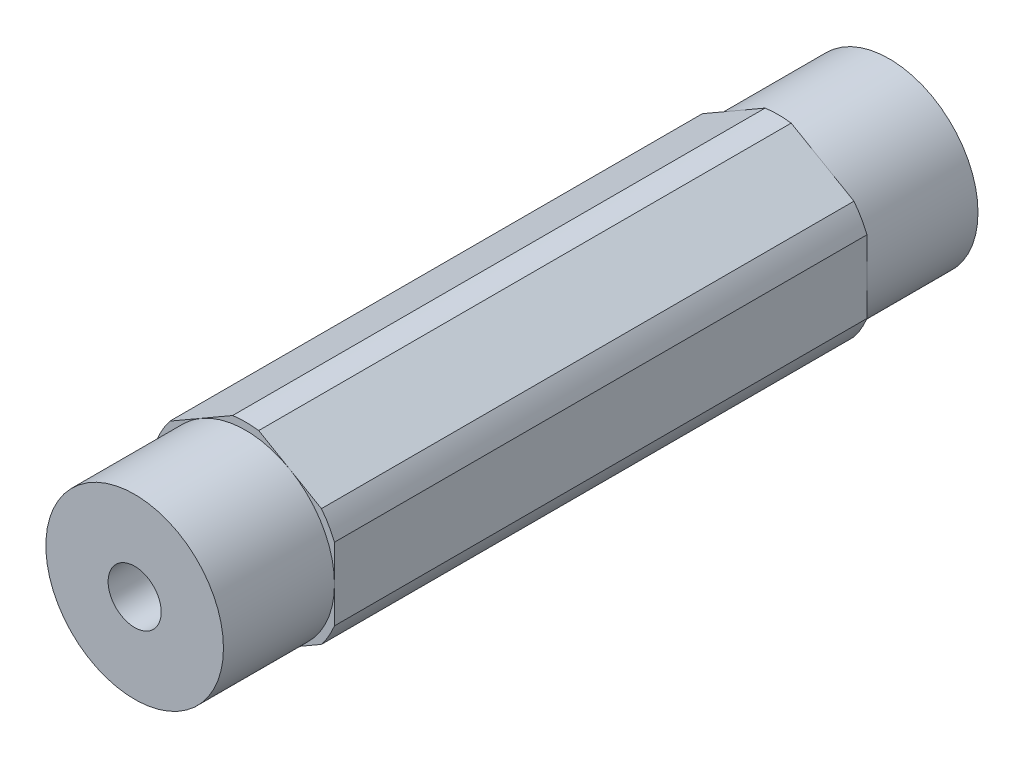
ISO-10303-21;
HEADER;
FILE_DESCRIPTION(('STEP AP214'),'2;1');
FILE_NAME('part.step','',(''),(''),'','','');
FILE_SCHEMA(('AUTOMOTIVE_DESIGN { 1 0 10303 214 1 1 1 1 }'));
ENDSEC;
DATA;
#1=APPLICATION_CONTEXT('core data for automotive mechanical design processes');
#2=APPLICATION_PROTOCOL_DEFINITION('international standard','automotive_design',2000,#1);
#3=PRODUCT_CONTEXT('',#1,'mechanical');
#4=PRODUCT('Part','Part','',(#3));
#5=PRODUCT_RELATED_PRODUCT_CATEGORY('part','',(#4));
#6=PRODUCT_DEFINITION_FORMATION('','',#4);
#7=PRODUCT_DEFINITION_CONTEXT('part definition',#1,'design');
#8=PRODUCT_DEFINITION('design','',#6,#7);
#9=PRODUCT_DEFINITION_SHAPE('','',#8);
#10=(LENGTH_UNIT() NAMED_UNIT(*) SI_UNIT(.MILLI.,.METRE.));
#11=(NAMED_UNIT(*) PLANE_ANGLE_UNIT() SI_UNIT($,.RADIAN.));
#12=(NAMED_UNIT(*) SI_UNIT($,.STERADIAN.) SOLID_ANGLE_UNIT());
#13=UNCERTAINTY_MEASURE_WITH_UNIT(LENGTH_MEASURE(1.E-05),#10,'distance_accuracy_value','');
#14=(GEOMETRIC_REPRESENTATION_CONTEXT(3) GLOBAL_UNCERTAINTY_ASSIGNED_CONTEXT((#13)) GLOBAL_UNIT_ASSIGNED_CONTEXT((#10,
#11,#12)) REPRESENTATION_CONTEXT('',''));
#15=CARTESIAN_POINT('',(0.,0.,0.));
#16=DIRECTION('',(0.,0.,1.));
#17=DIRECTION('',(1.,0.,0.));
#18=AXIS2_PLACEMENT_3D('',#15,#16,#17);
#19=CARTESIAN_POINT('',(6.35,0.,26.9748));
#20=DIRECTION('',(-1.,0.,0.));
#21=DIRECTION('',(0.,-1.,0.));
#22=AXIS2_PLACEMENT_3D('',#19,#20,#21);
#23=PLANE('',#22);
#24=DIRECTION('',(0.,0.,-1.));
#25=VECTOR('',#24,1.);
#26=CARTESIAN_POINT('',(6.35,-2.59030191290513,26.9748));
#27=LINE('',#26,#25);
#28=CARTESIAN_POINT('',(6.35,-2.59030191290513,19.0373));
#29=VERTEX_POINT('',#28);
#30=CARTESIAN_POINT('',(6.35,-2.59030191290513,-19.0373));
#31=VERTEX_POINT('',#30);
#32=EDGE_CURVE('E319',#29,#31,#27,.T.);
#33=ORIENTED_EDGE('',*,*,#32,.T.);
#34=DIRECTION('',(0.,1.,0.));
#35=VECTOR('',#34,1.);
#36=CARTESIAN_POINT('',(6.35,0.,-19.0373));
#37=LINE('',#36,#35);
#38=CARTESIAN_POINT('',(6.35,0.,-19.0373));
#39=VERTEX_POINT('',#38);
#40=EDGE_CURVE('E80',#31,#39,#37,.T.);
#41=ORIENTED_EDGE('',*,*,#40,.T.);
#42=CARTESIAN_POINT('',(6.35,2.59030191290514,-19.0373));
#43=VERTEX_POINT('',#42);
#44=EDGE_CURVE('E271',#39,#43,#37,.T.);
#45=ORIENTED_EDGE('',*,*,#44,.T.);
#46=DIRECTION('',(0.,0.,-1.));
#47=VECTOR('',#46,1.);
#48=CARTESIAN_POINT('',(6.35,2.59030191290514,26.9748));
#49=LINE('',#48,#47);
#50=CARTESIAN_POINT('',(6.35,2.59030191290514,19.0373));
#51=VERTEX_POINT('',#50);
#52=EDGE_CURVE('E363',#51,#43,#49,.T.);
#53=ORIENTED_EDGE('',*,*,#52,.F.);
#54=DIRECTION('',(0.,1.,0.));
#55=VECTOR('',#54,1.);
#56=CARTESIAN_POINT('',(6.35,0.,19.0373));
#57=LINE('',#56,#55);
#58=CARTESIAN_POINT('',(6.35,0.,19.0373));
#59=VERTEX_POINT('',#58);
#60=EDGE_CURVE('E315',#59,#51,#57,.T.);
#61=ORIENTED_EDGE('',*,*,#60,.F.);
#62=EDGE_CURVE('E318',#29,#59,#57,.T.);
#63=ORIENTED_EDGE('',*,*,#62,.F.);
#64=EDGE_LOOP('',(#33,#41,#45,#53,#61,#63));
#65=FACE_BOUND('',#64,.T.);
#66=ADVANCED_FACE('F65',(#65),#23,.F.);
#67=CARTESIAN_POINT('',(0.,0.,26.9748));
#68=DIRECTION('',(0.,0.,-1.));
#69=DIRECTION('',(-1.,0.,0.));
#70=AXIS2_PLACEMENT_3D('',#67,#68,#69);
#71=CYLINDRICAL_SURFACE('',#70,6.858);
#72=ORIENTED_EDGE('',*,*,#52,.T.);
#73=CARTESIAN_POINT('',(0.,0.,-19.0373));
#74=DIRECTION('',(0.,0.,1.));
#75=DIRECTION('',(1.,0.,0.));
#76=AXIS2_PLACEMENT_3D('',#73,#74,#75);
#77=CIRCLE('',#76,6.858);
#78=CARTESIAN_POINT('',(5.41826726004727,4.20411035757862,-19.0373));
#79=VERTEX_POINT('',#78);
#80=EDGE_CURVE('E267',#43,#79,#77,.T.);
#81=ORIENTED_EDGE('',*,*,#80,.T.);
#82=DIRECTION('',(0.,0.,-1.));
#83=VECTOR('',#82,1.);
#84=CARTESIAN_POINT('',(5.41826726004728,4.20411035757862,26.9748));
#85=LINE('',#84,#83);
#86=CARTESIAN_POINT('',(5.41826726004727,4.20411035757862,19.0373));
#87=VERTEX_POINT('',#86);
#88=EDGE_CURVE('E359',#87,#79,#85,.T.);
#89=ORIENTED_EDGE('',*,*,#88,.F.);
#90=CARTESIAN_POINT('',(0.,0.,19.0373));
#91=DIRECTION('',(0.,0.,1.));
#92=DIRECTION('',(1.,0.,0.));
#93=AXIS2_PLACEMENT_3D('',#90,#91,#92);
#94=CIRCLE('',#93,6.858);
#95=EDGE_CURVE('E312',#51,#87,#94,.T.);
#96=ORIENTED_EDGE('',*,*,#95,.F.);
#97=EDGE_LOOP('',(#72,#81,#89,#96));
#98=FACE_BOUND('',#97,.T.);
#99=ADVANCED_FACE('F399',(#98),#71,.T.);
#100=CARTESIAN_POINT('',(3.175,5.49926131403118,26.9748));
#101=DIRECTION('',(-0.5,-0.866025403784439,0.));
#102=DIRECTION('',(0.866025403784439,-0.5,0.));
#103=AXIS2_PLACEMENT_3D('',#100,#101,#102);
#104=PLANE('',#103);
#105=ORIENTED_EDGE('',*,*,#88,.T.);
#106=DIRECTION('',(-0.866025403784439,0.5,0.));
#107=VECTOR('',#106,1.);
#108=CARTESIAN_POINT('',(3.175,5.49926131403118,-19.0373));
#109=LINE('',#108,#107);
#110=CARTESIAN_POINT('',(3.175,5.49926131403118,-19.0373));
#111=VERTEX_POINT('',#110);
#112=EDGE_CURVE('E266',#79,#111,#109,.T.);
#113=ORIENTED_EDGE('',*,*,#112,.T.);
#114=CARTESIAN_POINT('',(0.931732739952727,6.79441227048375,-19.0373));
#115=VERTEX_POINT('',#114);
#116=EDGE_CURVE('E262',#111,#115,#109,.T.);
#117=ORIENTED_EDGE('',*,*,#116,.T.);
#118=DIRECTION('',(0.,0.,-1.));
#119=VECTOR('',#118,1.);
#120=CARTESIAN_POINT('',(0.931732739952727,6.79441227048375,26.9748));
#121=LINE('',#120,#119);
#122=CARTESIAN_POINT('',(0.931732739952727,6.79441227048375,19.0373));
#123=VERTEX_POINT('',#122);
#124=EDGE_CURVE('E355',#123,#115,#121,.T.);
#125=ORIENTED_EDGE('',*,*,#124,.F.);
#126=DIRECTION('',(-0.866025403784439,0.5,0.));
#127=VECTOR('',#126,1.);
#128=CARTESIAN_POINT('',(3.175,5.49926131403118,19.0373));
#129=LINE('',#128,#127);
#130=CARTESIAN_POINT('',(3.175,5.49926131403119,19.0373));
#131=VERTEX_POINT('',#130);
#132=EDGE_CURVE('E308',#131,#123,#129,.T.);
#133=ORIENTED_EDGE('',*,*,#132,.F.);
#134=EDGE_CURVE('E311',#87,#131,#129,.T.);
#135=ORIENTED_EDGE('',*,*,#134,.F.);
#136=EDGE_LOOP('',(#105,#113,#117,#125,#133,#135));
#137=FACE_BOUND('',#136,.T.);
#138=ADVANCED_FACE('F405',(#137),#104,.F.);
#139=ORIENTED_EDGE('',*,*,#124,.T.);
#140=CARTESIAN_POINT('',(0.,0.,-19.0373));
#141=DIRECTION('',(0.,0.,1.));
#142=DIRECTION('',(1.,0.,0.));
#143=AXIS2_PLACEMENT_3D('',#140,#141,#142);
#144=CIRCLE('',#143,6.858);
#145=CARTESIAN_POINT('',(-0.931732739952726,6.79441227048375,-19.0373));
#146=VERTEX_POINT('',#145);
#147=EDGE_CURVE('E258',#115,#146,#144,.T.);
#148=ORIENTED_EDGE('',*,*,#147,.T.);
#149=DIRECTION('',(0.,0.,-1.));
#150=VECTOR('',#149,1.);
#151=CARTESIAN_POINT('',(-0.931732739952726,6.79441227048375,26.9748));
#152=LINE('',#151,#150);
#153=CARTESIAN_POINT('',(-0.931732739952726,6.79441227048375,19.0373));
#154=VERTEX_POINT('',#153);
#155=EDGE_CURVE('E351',#154,#146,#152,.T.);
#156=ORIENTED_EDGE('',*,*,#155,.F.);
#157=CARTESIAN_POINT('',(0.,0.,19.0373));
#158=DIRECTION('',(0.,0.,1.));
#159=DIRECTION('',(1.,0.,0.));
#160=AXIS2_PLACEMENT_3D('',#157,#158,#159);
#161=CIRCLE('',#160,6.858);
#162=EDGE_CURVE('E305',#123,#154,#161,.T.);
#163=ORIENTED_EDGE('',*,*,#162,.F.);
#164=EDGE_LOOP('',(#139,#148,#156,#163));
#165=FACE_BOUND('',#164,.T.);
#166=ADVANCED_FACE('F408',(#165),#71,.T.);
#167=CARTESIAN_POINT('',(-3.175,5.49926131403118,26.9748));
#168=DIRECTION('',(0.5,-0.866025403784439,0.));
#169=DIRECTION('',(0.866025403784439,0.5,0.));
#170=AXIS2_PLACEMENT_3D('',#167,#168,#169);
#171=PLANE('',#170);
#172=ORIENTED_EDGE('',*,*,#155,.T.);
#173=DIRECTION('',(-0.866025403784439,-0.5,0.));
#174=VECTOR('',#173,1.);
#175=CARTESIAN_POINT('',(-3.175,5.49926131403118,-19.0373));
#176=LINE('',#175,#174);
#177=CARTESIAN_POINT('',(-3.175,5.49926131403118,-19.0373));
#178=VERTEX_POINT('',#177);
#179=EDGE_CURVE('E257',#146,#178,#176,.T.);
#180=ORIENTED_EDGE('',*,*,#179,.T.);
#181=CARTESIAN_POINT('',(-5.41826726004727,4.20411035757862,-19.0373));
#182=VERTEX_POINT('',#181);
#183=EDGE_CURVE('E253',#178,#182,#176,.T.);
#184=ORIENTED_EDGE('',*,*,#183,.T.);
#185=DIRECTION('',(0.,0.,-1.));
#186=VECTOR('',#185,1.);
#187=CARTESIAN_POINT('',(-5.41826726004728,4.20411035757862,26.9748));
#188=LINE('',#187,#186);
#189=CARTESIAN_POINT('',(-5.41826726004727,4.20411035757862,19.0373));
#190=VERTEX_POINT('',#189);
#191=EDGE_CURVE('E347',#190,#182,#188,.T.);
#192=ORIENTED_EDGE('',*,*,#191,.F.);
#193=DIRECTION('',(-0.866025403784439,-0.5,0.));
#194=VECTOR('',#193,1.);
#195=CARTESIAN_POINT('',(-3.175,5.49926131403118,19.0373));
#196=LINE('',#195,#194);
#197=CARTESIAN_POINT('',(-3.175,5.49926131403118,19.0373));
#198=VERTEX_POINT('',#197);
#199=EDGE_CURVE('E301',#198,#190,#196,.T.);
#200=ORIENTED_EDGE('',*,*,#199,.F.);
#201=EDGE_CURVE('E304',#154,#198,#196,.T.);
#202=ORIENTED_EDGE('',*,*,#201,.F.);
#203=EDGE_LOOP('',(#172,#180,#184,#192,#200,#202));
#204=FACE_BOUND('',#203,.T.);
#205=ADVANCED_FACE('F470',(#204),#171,.F.);
#206=ORIENTED_EDGE('',*,*,#191,.T.);
#207=CARTESIAN_POINT('',(0.,0.,-19.0373));
#208=DIRECTION('',(0.,0.,1.));
#209=DIRECTION('',(1.,0.,0.));
#210=AXIS2_PLACEMENT_3D('',#207,#208,#209);
#211=CIRCLE('',#210,6.858);
#212=CARTESIAN_POINT('',(-6.35,2.59030191290514,-19.0373));
#213=VERTEX_POINT('',#212);
#214=EDGE_CURVE('E249',#182,#213,#211,.T.);
#215=ORIENTED_EDGE('',*,*,#214,.T.);
#216=DIRECTION('',(0.,0.,-1.));
#217=VECTOR('',#216,1.);
#218=CARTESIAN_POINT('',(-6.35,2.59030191290514,26.9748));
#219=LINE('',#218,#217);
#220=CARTESIAN_POINT('',(-6.35,2.59030191290514,19.0373));
#221=VERTEX_POINT('',#220);
#222=EDGE_CURVE('E343',#221,#213,#219,.T.);
#223=ORIENTED_EDGE('',*,*,#222,.F.);
#224=CARTESIAN_POINT('',(0.,0.,19.0373));
#225=DIRECTION('',(0.,0.,1.));
#226=DIRECTION('',(1.,0.,0.));
#227=AXIS2_PLACEMENT_3D('',#224,#225,#226);
#228=CIRCLE('',#227,6.858);
#229=EDGE_CURVE('E298',#190,#221,#228,.T.);
#230=ORIENTED_EDGE('',*,*,#229,.F.);
#231=EDGE_LOOP('',(#206,#215,#223,#230));
#232=FACE_BOUND('',#231,.T.);
#233=ADVANCED_FACE('F474',(#232),#71,.T.);
#234=CARTESIAN_POINT('',(-6.35,0.,26.9748));
#235=DIRECTION('',(1.,0.,0.));
#236=DIRECTION('',(0.,1.,0.));
#237=AXIS2_PLACEMENT_3D('',#234,#235,#236);
#238=PLANE('',#237);
#239=ORIENTED_EDGE('',*,*,#222,.T.);
#240=DIRECTION('',(0.,-1.,0.));
#241=VECTOR('',#240,1.);
#242=CARTESIAN_POINT('',(-6.35,0.,-19.0373));
#243=LINE('',#242,#241);
#244=CARTESIAN_POINT('',(-6.35,0.,-19.0373));
#245=VERTEX_POINT('',#244);
#246=EDGE_CURVE('E248',#213,#245,#243,.T.);
#247=ORIENTED_EDGE('',*,*,#246,.T.);
#248=CARTESIAN_POINT('',(-6.35,-2.59030191290514,-19.0373));
#249=VERTEX_POINT('',#248);
#250=EDGE_CURVE('E244',#245,#249,#243,.T.);
#251=ORIENTED_EDGE('',*,*,#250,.T.);
#252=DIRECTION('',(0.,0.,-1.));
#253=VECTOR('',#252,1.);
#254=CARTESIAN_POINT('',(-6.35,-2.59030191290514,26.9748));
#255=LINE('',#254,#253);
#256=CARTESIAN_POINT('',(-6.35,-2.59030191290514,19.0373));
#257=VERTEX_POINT('',#256);
#258=EDGE_CURVE('E339',#257,#249,#255,.T.);
#259=ORIENTED_EDGE('',*,*,#258,.F.);
#260=DIRECTION('',(0.,-1.,0.));
#261=VECTOR('',#260,1.);
#262=CARTESIAN_POINT('',(-6.35,0.,19.0373));
#263=LINE('',#262,#261);
#264=CARTESIAN_POINT('',(-6.35,0.,19.0373));
#265=VERTEX_POINT('',#264);
#266=EDGE_CURVE('E294',#265,#257,#263,.T.);
#267=ORIENTED_EDGE('',*,*,#266,.F.);
#268=EDGE_CURVE('E297',#221,#265,#263,.T.);
#269=ORIENTED_EDGE('',*,*,#268,.F.);
#270=EDGE_LOOP('',(#239,#247,#251,#259,#267,#269));
#271=FACE_BOUND('',#270,.T.);
#272=ADVANCED_FACE('F464',(#271),#238,.F.);
#273=ORIENTED_EDGE('',*,*,#258,.T.);
#274=CARTESIAN_POINT('',(0.,0.,-19.0373));
#275=DIRECTION('',(0.,0.,1.));
#276=DIRECTION('',(1.,0.,0.));
#277=AXIS2_PLACEMENT_3D('',#274,#275,#276);
#278=CIRCLE('',#277,6.858);
#279=CARTESIAN_POINT('',(-5.41826726004727,-4.20411035757862,-19.0373));
#280=VERTEX_POINT('',#279);
#281=EDGE_CURVE('E240',#249,#280,#278,.T.);
#282=ORIENTED_EDGE('',*,*,#281,.T.);
#283=DIRECTION('',(0.,0.,-1.));
#284=VECTOR('',#283,1.);
#285=CARTESIAN_POINT('',(-5.41826726004727,-4.20411035757862,26.9748));
#286=LINE('',#285,#284);
#287=CARTESIAN_POINT('',(-5.41826726004727,-4.20411035757862,19.0373));
#288=VERTEX_POINT('',#287);
#289=EDGE_CURVE('E335',#288,#280,#286,.T.);
#290=ORIENTED_EDGE('',*,*,#289,.F.);
#291=CARTESIAN_POINT('',(0.,0.,19.0373));
#292=DIRECTION('',(0.,0.,1.));
#293=DIRECTION('',(1.,0.,0.));
#294=AXIS2_PLACEMENT_3D('',#291,#292,#293);
#295=CIRCLE('',#294,6.858);
#296=EDGE_CURVE('E291',#257,#288,#295,.T.);
#297=ORIENTED_EDGE('',*,*,#296,.F.);
#298=EDGE_LOOP('',(#273,#282,#290,#297));
#299=FACE_BOUND('',#298,.T.);
#300=ADVANCED_FACE('F459',(#299),#71,.T.);
#301=CARTESIAN_POINT('',(-3.175,-5.49926131403119,26.9748));
#302=DIRECTION('',(0.5,0.866025403784439,0.));
#303=DIRECTION('',(-0.866025403784439,0.5,0.));
#304=AXIS2_PLACEMENT_3D('',#301,#302,#303);
#305=PLANE('',#304);
#306=ORIENTED_EDGE('',*,*,#289,.T.);
#307=DIRECTION('',(0.866025403784439,-0.5,0.));
#308=VECTOR('',#307,1.);
#309=CARTESIAN_POINT('',(-3.175,-5.49926131403119,-19.0373));
#310=LINE('',#309,#308);
#311=CARTESIAN_POINT('',(-3.175,-5.49926131403119,-19.0373));
#312=VERTEX_POINT('',#311);
#313=EDGE_CURVE('E239',#280,#312,#310,.T.);
#314=ORIENTED_EDGE('',*,*,#313,.T.);
#315=CARTESIAN_POINT('',(-0.931732739952723,-6.79441227048375,-19.0373));
#316=VERTEX_POINT('',#315);
#317=EDGE_CURVE('E235',#312,#316,#310,.T.);
#318=ORIENTED_EDGE('',*,*,#317,.T.);
#319=DIRECTION('',(0.,0.,-1.));
#320=VECTOR('',#319,1.);
#321=CARTESIAN_POINT('',(-0.931732739952723,-6.79441227048375,26.9748));
#322=LINE('',#321,#320);
#323=CARTESIAN_POINT('',(-0.931732739952723,-6.79441227048375,19.0373));
#324=VERTEX_POINT('',#323);
#325=EDGE_CURVE('E331',#324,#316,#322,.T.);
#326=ORIENTED_EDGE('',*,*,#325,.F.);
#327=DIRECTION('',(0.866025403784439,-0.5,0.));
#328=VECTOR('',#327,1.);
#329=CARTESIAN_POINT('',(-3.175,-5.49926131403119,19.0373));
#330=LINE('',#329,#328);
#331=CARTESIAN_POINT('',(-3.175,-5.49926131403119,19.0373));
#332=VERTEX_POINT('',#331);
#333=EDGE_CURVE('E287',#332,#324,#330,.T.);
#334=ORIENTED_EDGE('',*,*,#333,.F.);
#335=EDGE_CURVE('E290',#288,#332,#330,.T.);
#336=ORIENTED_EDGE('',*,*,#335,.F.);
#337=EDGE_LOOP('',(#306,#314,#318,#326,#334,#336));
#338=FACE_BOUND('',#337,.T.);
#339=ADVANCED_FACE('F452',(#338),#305,.F.);
#340=ORIENTED_EDGE('',*,*,#325,.T.);
#341=CARTESIAN_POINT('',(0.,0.,-19.0373));
#342=DIRECTION('',(0.,0.,1.));
#343=DIRECTION('',(1.,0.,0.));
#344=AXIS2_PLACEMENT_3D('',#341,#342,#343);
#345=CIRCLE('',#344,6.858);
#346=CARTESIAN_POINT('',(0.93173273995273,-6.79441227048375,-19.0373));
#347=VERTEX_POINT('',#346);
#348=EDGE_CURVE('E231',#316,#347,#345,.T.);
#349=ORIENTED_EDGE('',*,*,#348,.T.);
#350=DIRECTION('',(0.,0.,-1.));
#351=VECTOR('',#350,1.);
#352=CARTESIAN_POINT('',(0.93173273995273,-6.79441227048375,26.9748));
#353=LINE('',#352,#351);
#354=CARTESIAN_POINT('',(0.93173273995273,-6.79441227048375,19.0373));
#355=VERTEX_POINT('',#354);
#356=EDGE_CURVE('E327',#355,#347,#353,.T.);
#357=ORIENTED_EDGE('',*,*,#356,.F.);
#358=CARTESIAN_POINT('',(0.,0.,19.0373));
#359=DIRECTION('',(0.,0.,1.));
#360=DIRECTION('',(1.,0.,0.));
#361=AXIS2_PLACEMENT_3D('',#358,#359,#360);
#362=CIRCLE('',#361,6.858);
#363=EDGE_CURVE('E284',#324,#355,#362,.T.);
#364=ORIENTED_EDGE('',*,*,#363,.F.);
#365=EDGE_LOOP('',(#340,#349,#357,#364));
#366=FACE_BOUND('',#365,.T.);
#367=ADVANCED_FACE('F520',(#366),#71,.T.);
#368=CARTESIAN_POINT('',(3.175,-5.49926131403119,26.9748));
#369=DIRECTION('',(-0.5,0.866025403784439,0.));
#370=DIRECTION('',(-0.866025403784439,-0.5,0.));
#371=AXIS2_PLACEMENT_3D('',#368,#369,#370);
#372=PLANE('',#371);
#373=ORIENTED_EDGE('',*,*,#356,.T.);
#374=DIRECTION('',(0.866025403784439,0.5,0.));
#375=VECTOR('',#374,1.);
#376=CARTESIAN_POINT('',(3.175,-5.49926131403119,-19.0373));
#377=LINE('',#376,#375);
#378=CARTESIAN_POINT('',(3.175,-5.49926131403118,-19.0373));
#379=VERTEX_POINT('',#378);
#380=EDGE_CURVE('E230',#347,#379,#377,.T.);
#381=ORIENTED_EDGE('',*,*,#380,.T.);
#382=CARTESIAN_POINT('',(5.41826726004727,-4.20411035757862,-19.0373));
#383=VERTEX_POINT('',#382);
#384=EDGE_CURVE('E225',#379,#383,#377,.T.);
#385=ORIENTED_EDGE('',*,*,#384,.T.);
#386=DIRECTION('',(0.,0.,-1.));
#387=VECTOR('',#386,1.);
#388=CARTESIAN_POINT('',(5.41826726004727,-4.20411035757862,26.9748));
#389=LINE('',#388,#387);
#390=CARTESIAN_POINT('',(5.41826726004727,-4.20411035757862,19.0373));
#391=VERTEX_POINT('',#390);
#392=EDGE_CURVE('E323',#391,#383,#389,.T.);
#393=ORIENTED_EDGE('',*,*,#392,.F.);
#394=DIRECTION('',(0.866025403784439,0.5,0.));
#395=VECTOR('',#394,1.);
#396=CARTESIAN_POINT('',(3.175,-5.49926131403119,19.0373));
#397=LINE('',#396,#395);
#398=CARTESIAN_POINT('',(3.175,-5.49926131403119,19.0373));
#399=VERTEX_POINT('',#398);
#400=EDGE_CURVE('E87',#399,#391,#397,.T.);
#401=ORIENTED_EDGE('',*,*,#400,.F.);
#402=EDGE_CURVE('E283',#355,#399,#397,.T.);
#403=ORIENTED_EDGE('',*,*,#402,.F.);
#404=EDGE_LOOP('',(#373,#381,#385,#393,#401,#403));
#405=FACE_BOUND('',#404,.T.);
#406=ADVANCED_FACE('F418',(#405),#372,.F.);
#407=ORIENTED_EDGE('',*,*,#392,.T.);
#408=CARTESIAN_POINT('',(0.,0.,-19.0373));
#409=DIRECTION('',(0.,0.,1.));
#410=DIRECTION('',(1.,0.,0.));
#411=AXIS2_PLACEMENT_3D('',#408,#409,#410);
#412=CIRCLE('',#411,6.858);
#413=EDGE_CURVE('E12',#383,#31,#412,.T.);
#414=ORIENTED_EDGE('',*,*,#413,.T.);
#415=ORIENTED_EDGE('',*,*,#32,.F.);
#416=CARTESIAN_POINT('',(0.,0.,19.0373));
#417=DIRECTION('',(0.,0.,1.));
#418=DIRECTION('',(1.,0.,0.));
#419=AXIS2_PLACEMENT_3D('',#416,#417,#418);
#420=CIRCLE('',#419,6.858);
#421=EDGE_CURVE('E371',#391,#29,#420,.T.);
#422=ORIENTED_EDGE('',*,*,#421,.F.);
#423=EDGE_LOOP('',(#407,#414,#415,#422));
#424=FACE_BOUND('',#423,.T.);
#425=ADVANCED_FACE('F409',(#424),#71,.T.);
#426=CARTESIAN_POINT('',(0.,0.,19.0373));
#427=DIRECTION('',(0.,0.,1.));
#428=DIRECTION('',(1.,0.,0.));
#429=AXIS2_PLACEMENT_3D('',#426,#427,#428);
#430=PLANE('',#429);
#431=ORIENTED_EDGE('',*,*,#62,.T.);
#432=CARTESIAN_POINT('',(0.,0.,19.0373));
#433=DIRECTION('',(0.,0.,1.));
#434=DIRECTION('',(1.,0.,0.));
#435=AXIS2_PLACEMENT_3D('',#432,#433,#434);
#436=CIRCLE('',#435,6.35);
#437=EDGE_CURVE('E280',#399,#59,#436,.T.);
#438=ORIENTED_EDGE('',*,*,#437,.F.);
#439=ORIENTED_EDGE('',*,*,#400,.T.);
#440=ORIENTED_EDGE('',*,*,#421,.T.);
#441=EDGE_LOOP('',(#431,#438,#439,#440));
#442=FACE_BOUND('',#441,.T.);
#443=ADVANCED_FACE('F529',(#442),#430,.T.);
#444=ORIENTED_EDGE('',*,*,#60,.T.);
#445=ORIENTED_EDGE('',*,*,#95,.T.);
#446=ORIENTED_EDGE('',*,*,#134,.T.);
#447=EDGE_CURVE('E275',#59,#131,#436,.T.);
#448=ORIENTED_EDGE('',*,*,#447,.F.);
#449=EDGE_LOOP('',(#444,#445,#446,#448));
#450=FACE_BOUND('',#449,.T.);
#451=ADVANCED_FACE('F503',(#450),#430,.T.);
#452=ORIENTED_EDGE('',*,*,#132,.T.);
#453=ORIENTED_EDGE('',*,*,#162,.T.);
#454=ORIENTED_EDGE('',*,*,#201,.T.);
#455=EDGE_CURVE('E279',#131,#198,#436,.T.);
#456=ORIENTED_EDGE('',*,*,#455,.F.);
#457=EDGE_LOOP('',(#452,#453,#454,#456));
#458=FACE_BOUND('',#457,.T.);
#459=ADVANCED_FACE('F511',(#458),#430,.T.);
#460=ORIENTED_EDGE('',*,*,#199,.T.);
#461=ORIENTED_EDGE('',*,*,#229,.T.);
#462=ORIENTED_EDGE('',*,*,#268,.T.);
#463=EDGE_CURVE('E486',#198,#265,#436,.T.);
#464=ORIENTED_EDGE('',*,*,#463,.F.);
#465=EDGE_LOOP('',(#460,#461,#462,#464));
#466=FACE_BOUND('',#465,.T.);
#467=ADVANCED_FACE('F477',(#466),#430,.T.);
#468=ORIENTED_EDGE('',*,*,#266,.T.);
#469=ORIENTED_EDGE('',*,*,#296,.T.);
#470=ORIENTED_EDGE('',*,*,#335,.T.);
#471=EDGE_CURVE('E489',#265,#332,#436,.T.);
#472=ORIENTED_EDGE('',*,*,#471,.F.);
#473=EDGE_LOOP('',(#468,#469,#470,#472));
#474=FACE_BOUND('',#473,.T.);
#475=ADVANCED_FACE('F651',(#474),#430,.T.);
#476=ORIENTED_EDGE('',*,*,#333,.T.);
#477=ORIENTED_EDGE('',*,*,#363,.T.);
#478=ORIENTED_EDGE('',*,*,#402,.T.);
#479=EDGE_CURVE('E492',#332,#399,#436,.T.);
#480=ORIENTED_EDGE('',*,*,#479,.F.);
#481=EDGE_LOOP('',(#476,#477,#478,#480));
#482=FACE_BOUND('',#481,.T.);
#483=ADVANCED_FACE('F518',(#482),#430,.T.);
#484=CARTESIAN_POINT('',(0.,0.,26.974812));
#485=DIRECTION('',(0.,0.,-1.));
#486=DIRECTION('',(-1.,0.,0.));
#487=AXIS2_PLACEMENT_3D('',#484,#485,#486);
#488=CYLINDRICAL_SURFACE('',#487,6.35);
#489=CARTESIAN_POINT('',(0.,0.,26.9748));
#490=DIRECTION('',(0.,0.,1.));
#491=DIRECTION('',(1.,0.,0.));
#492=AXIS2_PLACEMENT_3D('',#489,#490,#491);
#493=CIRCLE('',#492,6.35);
#494=CARTESIAN_POINT('',(6.35,0.,26.9748));
#495=VERTEX_POINT('',#494);
#496=EDGE_CURVE('E367',#495,#495,#493,.F.);
#497=ORIENTED_EDGE('',*,*,#496,.T.);
#498=EDGE_LOOP('',(#497));
#499=FACE_BOUND('',#498,.T.);
#500=ORIENTED_EDGE('',*,*,#455,.T.);
#501=ORIENTED_EDGE('',*,*,#463,.T.);
#502=ORIENTED_EDGE('',*,*,#471,.T.);
#503=ORIENTED_EDGE('',*,*,#479,.T.);
#504=ORIENTED_EDGE('',*,*,#437,.T.);
#505=ORIENTED_EDGE('',*,*,#447,.T.);
#506=EDGE_LOOP('',(#500,#501,#502,#503,#504,#505));
#507=FACE_BOUND('',#506,.T.);
#508=ADVANCED_FACE('F499',(#499,#507),#488,.T.);
#509=CARTESIAN_POINT('',(0.,0.,26.9748));
#510=DIRECTION('',(0.,0.,1.));
#511=DIRECTION('',(1.,0.,0.));
#512=AXIS2_PLACEMENT_3D('',#509,#510,#511);
#513=PLANE('',#512);
#514=CARTESIAN_POINT('',(0.,0.,26.9748));
#515=DIRECTION('',(0.,0.,1.));
#516=DIRECTION('',(1.,0.,0.));
#517=AXIS2_PLACEMENT_3D('',#514,#515,#516);
#518=CIRCLE('',#517,1.89865);
#519=CARTESIAN_POINT('',(1.89865,0.,26.9748));
#520=VERTEX_POINT('',#519);
#521=EDGE_CURVE('E207',#520,#520,#518,.T.);
#522=ORIENTED_EDGE('',*,*,#521,.F.);
#523=EDGE_LOOP('',(#522));
#524=FACE_BOUND('',#523,.T.);
#525=ORIENTED_EDGE('',*,*,#496,.F.);
#526=EDGE_LOOP('',(#525));
#527=FACE_BOUND('',#526,.T.);
#528=ADVANCED_FACE('F554',(#524,#527),#513,.T.);
#529=CARTESIAN_POINT('',(0.,0.,-19.0373));
#530=DIRECTION('',(0.,0.,1.));
#531=DIRECTION('',(1.,0.,0.));
#532=AXIS2_PLACEMENT_3D('',#529,#530,#531);
#533=PLANE('',#532);
#534=ORIENTED_EDGE('',*,*,#413,.F.);
#535=ORIENTED_EDGE('',*,*,#384,.F.);
#536=CARTESIAN_POINT('',(0.,0.,-19.0373));
#537=DIRECTION('',(0.,0.,1.));
#538=DIRECTION('',(1.,0.,0.));
#539=AXIS2_PLACEMENT_3D('',#536,#537,#538);
#540=CIRCLE('',#539,6.35);
#541=EDGE_CURVE('E220',#379,#39,#540,.T.);
#542=ORIENTED_EDGE('',*,*,#541,.T.);
#543=ORIENTED_EDGE('',*,*,#40,.F.);
#544=EDGE_LOOP('',(#534,#535,#542,#543));
#545=FACE_BOUND('',#544,.T.);
#546=ADVANCED_FACE('F395',(#545),#533,.F.);
#547=EDGE_CURVE('E221',#39,#111,#540,.T.);
#548=ORIENTED_EDGE('',*,*,#547,.T.);
#549=ORIENTED_EDGE('',*,*,#112,.F.);
#550=ORIENTED_EDGE('',*,*,#80,.F.);
#551=ORIENTED_EDGE('',*,*,#44,.F.);
#552=EDGE_LOOP('',(#548,#549,#550,#551));
#553=FACE_BOUND('',#552,.T.);
#554=ADVANCED_FACE('F439',(#553),#533,.F.);
#555=EDGE_CURVE('E226',#111,#178,#540,.T.);
#556=ORIENTED_EDGE('',*,*,#555,.T.);
#557=ORIENTED_EDGE('',*,*,#179,.F.);
#558=ORIENTED_EDGE('',*,*,#147,.F.);
#559=ORIENTED_EDGE('',*,*,#116,.F.);
#560=EDGE_LOOP('',(#556,#557,#558,#559));
#561=FACE_BOUND('',#560,.T.);
#562=ADVANCED_FACE('F546',(#561),#533,.F.);
#563=EDGE_CURVE('E426',#178,#245,#540,.T.);
#564=ORIENTED_EDGE('',*,*,#563,.T.);
#565=ORIENTED_EDGE('',*,*,#246,.F.);
#566=ORIENTED_EDGE('',*,*,#214,.F.);
#567=ORIENTED_EDGE('',*,*,#183,.F.);
#568=EDGE_LOOP('',(#564,#565,#566,#567));
#569=FACE_BOUND('',#568,.T.);
#570=ADVANCED_FACE('F467',(#569),#533,.F.);
#571=EDGE_CURVE('E429',#245,#312,#540,.T.);
#572=ORIENTED_EDGE('',*,*,#571,.T.);
#573=ORIENTED_EDGE('',*,*,#313,.F.);
#574=ORIENTED_EDGE('',*,*,#281,.F.);
#575=ORIENTED_EDGE('',*,*,#250,.F.);
#576=EDGE_LOOP('',(#572,#573,#574,#575));
#577=FACE_BOUND('',#576,.T.);
#578=ADVANCED_FACE('F392',(#577),#533,.F.);
#579=EDGE_CURVE('E432',#312,#379,#540,.T.);
#580=ORIENTED_EDGE('',*,*,#579,.T.);
#581=ORIENTED_EDGE('',*,*,#380,.F.);
#582=ORIENTED_EDGE('',*,*,#348,.F.);
#583=ORIENTED_EDGE('',*,*,#317,.F.);
#584=EDGE_LOOP('',(#580,#581,#582,#583));
#585=FACE_BOUND('',#584,.T.);
#586=ADVANCED_FACE('F381',(#585),#533,.F.);
#587=CARTESIAN_POINT('',(0.,0.,-19.0373));
#588=DIRECTION('',(0.,0.,-1.));
#589=DIRECTION('',(-1.,0.,0.));
#590=AXIS2_PLACEMENT_3D('',#587,#588,#589);
#591=CYLINDRICAL_SURFACE('',#590,6.35);
#592=ORIENTED_EDGE('',*,*,#547,.F.);
#593=ORIENTED_EDGE('',*,*,#541,.F.);
#594=ORIENTED_EDGE('',*,*,#579,.F.);
#595=ORIENTED_EDGE('',*,*,#571,.F.);
#596=ORIENTED_EDGE('',*,*,#563,.F.);
#597=ORIENTED_EDGE('',*,*,#555,.F.);
#598=EDGE_LOOP('',(#592,#593,#594,#595,#596,#597));
#599=FACE_BOUND('',#598,.T.);
#600=CARTESIAN_POINT('',(0.,0.,-26.9748));
#601=DIRECTION('',(0.,0.,1.));
#602=DIRECTION('',(1.,0.,0.));
#603=AXIS2_PLACEMENT_3D('',#600,#601,#602);
#604=CIRCLE('',#603,6.35);
#605=CARTESIAN_POINT('',(6.35,0.,-26.9748));
#606=VERTEX_POINT('',#605);
#607=EDGE_CURVE('E73',#606,#606,#604,.F.);
#608=ORIENTED_EDGE('',*,*,#607,.F.);
#609=EDGE_LOOP('',(#608));
#610=FACE_BOUND('',#609,.T.);
#611=ADVANCED_FACE('F379',(#599,#610),#591,.T.);
#612=CARTESIAN_POINT('',(0.,0.,-26.9748));
#613=DIRECTION('',(0.,0.,1.));
#614=DIRECTION('',(1.,0.,0.));
#615=AXIS2_PLACEMENT_3D('',#612,#613,#614);
#616=PLANE('',#615);
#617=CARTESIAN_POINT('',(0.,0.,-26.9748));
#618=DIRECTION('',(0.,0.,-1.));
#619=DIRECTION('',(-1.,0.,0.));
#620=AXIS2_PLACEMENT_3D('',#617,#618,#619);
#621=CIRCLE('',#620,1.89865);
#622=CARTESIAN_POINT('',(-1.89865,0.,-26.9748));
#623=VERTEX_POINT('',#622);
#624=EDGE_CURVE('E206',#623,#623,#621,.T.);
#625=ORIENTED_EDGE('',*,*,#624,.F.);
#626=EDGE_LOOP('',(#625));
#627=FACE_BOUND('',#626,.T.);
#628=ORIENTED_EDGE('',*,*,#607,.T.);
#629=EDGE_LOOP('',(#628));
#630=FACE_BOUND('',#629,.T.);
#631=ADVANCED_FACE('F377',(#627,#630),#616,.F.);
#632=CARTESIAN_POINT('',(0.,0.,-15.0368));
#633=DIRECTION('',(0.,0.,-1.));
#634=DIRECTION('',(-1.,0.,0.));
#635=AXIS2_PLACEMENT_3D('',#632,#633,#634);
#636=CONICAL_SURFACE('',#635,1.89865,1.02974425867665);
#637=CARTESIAN_POINT('',(0.,0.,-13.8959759856833));
#638=VERTEX_POINT('',#637);
#639=VERTEX_LOOP('',#638);
#640=FACE_BOUND('',#639,.T.);
#641=CARTESIAN_POINT('',(0.,0.,-15.0368));
#642=DIRECTION('',(0.,0.,-1.));
#643=DIRECTION('',(-1.,0.,0.));
#644=AXIS2_PLACEMENT_3D('',#641,#642,#643);
#645=CIRCLE('',#644,1.89865);
#646=CARTESIAN_POINT('',(-1.89865,0.,-15.0368));
#647=VERTEX_POINT('',#646);
#648=EDGE_CURVE('E212',#647,#647,#645,.T.);
#649=ORIENTED_EDGE('',*,*,#648,.T.);
#650=EDGE_LOOP('',(#649));
#651=FACE_BOUND('',#650,.T.);
#652=ADVANCED_FACE('F389',(#640,#651),#636,.F.);
#653=CARTESIAN_POINT('',(0.,0.,-26.9748));
#654=DIRECTION('',(0.,0.,-1.));
#655=DIRECTION('',(-1.,0.,0.));
#656=AXIS2_PLACEMENT_3D('',#653,#654,#655);
#657=CYLINDRICAL_SURFACE('',#656,1.89865);
#658=ORIENTED_EDGE('',*,*,#648,.F.);
#659=EDGE_LOOP('',(#658));
#660=FACE_BOUND('',#659,.T.);
#661=ORIENTED_EDGE('',*,*,#624,.T.);
#662=EDGE_LOOP('',(#661));
#663=FACE_BOUND('',#662,.T.);
#664=ADVANCED_FACE('F199',(#660,#663),#657,.F.);
#665=CARTESIAN_POINT('',(0.,0.,15.0368));
#666=DIRECTION('',(0.,0.,1.));
#667=DIRECTION('',(1.,0.,0.));
#668=AXIS2_PLACEMENT_3D('',#665,#666,#667);
#669=CONICAL_SURFACE('',#668,1.89865,1.02974425867665);
#670=CARTESIAN_POINT('',(0.,0.,13.8959759856833));
#671=VERTEX_POINT('',#670);
#672=VERTEX_LOOP('',#671);
#673=FACE_BOUND('',#672,.T.);
#674=CARTESIAN_POINT('',(0.,0.,15.0368));
#675=DIRECTION('',(0.,0.,1.));
#676=DIRECTION('',(1.,0.,0.));
#677=AXIS2_PLACEMENT_3D('',#674,#675,#676);
#678=CIRCLE('',#677,1.89865);
#679=CARTESIAN_POINT('',(1.89865,0.,15.0368));
#680=VERTEX_POINT('',#679);
#681=EDGE_CURVE('E203',#680,#680,#678,.T.);
#682=ORIENTED_EDGE('',*,*,#681,.T.);
#683=EDGE_LOOP('',(#682));
#684=FACE_BOUND('',#683,.T.);
#685=ADVANCED_FACE('F195',(#673,#684),#669,.F.);
#686=CARTESIAN_POINT('',(0.,0.,26.9748));
#687=DIRECTION('',(0.,0.,1.));
#688=DIRECTION('',(1.,0.,0.));
#689=AXIS2_PLACEMENT_3D('',#686,#687,#688);
#690=CYLINDRICAL_SURFACE('',#689,1.89865);
#691=ORIENTED_EDGE('',*,*,#681,.F.);
#692=EDGE_LOOP('',(#691));
#693=FACE_BOUND('',#692,.T.);
#694=ORIENTED_EDGE('',*,*,#521,.T.);
#695=EDGE_LOOP('',(#694));
#696=FACE_BOUND('',#695,.T.);
#697=ADVANCED_FACE('F198',(#693,#696),#690,.F.);
#698=CLOSED_SHELL('',(#66,#99,#138,#166,#205,#233,#272,#300,#339,#367,#406,#425,#443,#451,#459,
#467,#475,#483,#508,#528,#546,#554,#562,#570,#578,#586,#611,#631,#652,#664,#685,#697));
#699=MANIFOLD_SOLID_BREP('B2',#698);
#700=ADVANCED_BREP_SHAPE_REPRESENTATION('',(#18,#699),#14);
#701=SHAPE_DEFINITION_REPRESENTATION(#9,#700);
ENDSEC;
END-ISO-10303-21;
